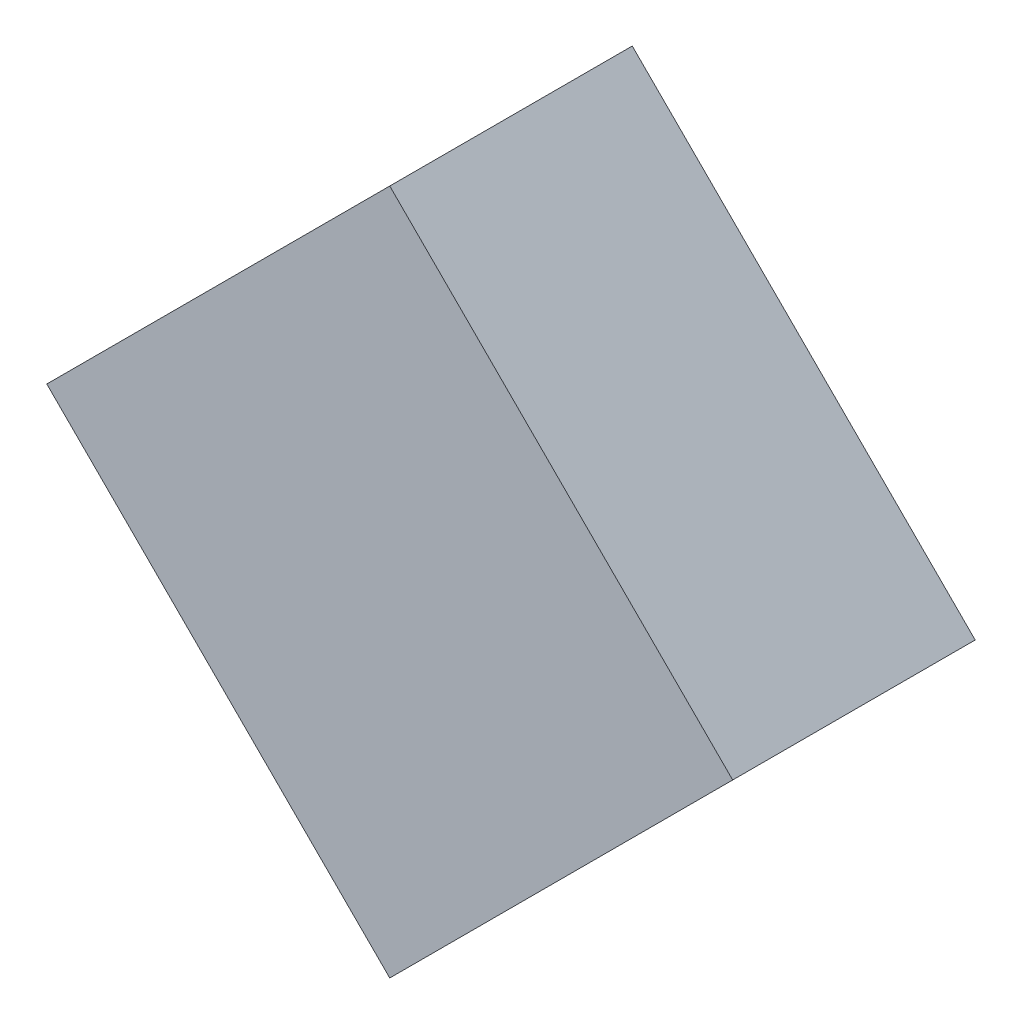
ISO-10303-21;
HEADER;
FILE_DESCRIPTION(('STEP AP214'),'2;1');
FILE_NAME('part.step','',(''),(''),'','','');
FILE_SCHEMA(('AUTOMOTIVE_DESIGN { 1 0 10303 214 1 1 1 1 }'));
ENDSEC;
DATA;
#1=APPLICATION_CONTEXT('core data for automotive mechanical design processes');
#2=APPLICATION_PROTOCOL_DEFINITION('international standard','automotive_design',2000,#1);
#3=PRODUCT_CONTEXT('',#1,'mechanical');
#4=PRODUCT('Part','Part','',(#3));
#5=PRODUCT_RELATED_PRODUCT_CATEGORY('part','',(#4));
#6=PRODUCT_DEFINITION_FORMATION('','',#4);
#7=PRODUCT_DEFINITION_CONTEXT('part definition',#1,'design');
#8=PRODUCT_DEFINITION('design','',#6,#7);
#9=PRODUCT_DEFINITION_SHAPE('','',#8);
#10=(LENGTH_UNIT() NAMED_UNIT(*) SI_UNIT(.MILLI.,.METRE.));
#11=(NAMED_UNIT(*) PLANE_ANGLE_UNIT() SI_UNIT($,.RADIAN.));
#12=(NAMED_UNIT(*) SI_UNIT($,.STERADIAN.) SOLID_ANGLE_UNIT());
#13=UNCERTAINTY_MEASURE_WITH_UNIT(LENGTH_MEASURE(1.E-05),#10,'distance_accuracy_value','');
#14=(GEOMETRIC_REPRESENTATION_CONTEXT(3) GLOBAL_UNCERTAINTY_ASSIGNED_CONTEXT((#13)) GLOBAL_UNIT_ASSIGNED_CONTEXT((#10,
#11,#12)) REPRESENTATION_CONTEXT('',''));
#15=CARTESIAN_POINT('',(0.,0.,0.));
#16=DIRECTION('',(0.,0.,1.));
#17=DIRECTION('',(1.,0.,0.));
#18=AXIS2_PLACEMENT_3D('',#15,#16,#17);
#19=CARTESIAN_POINT('',(88.557359312881,-22.95735931288,139.));
#20=DIRECTION('',(0.,0.,1.));
#21=DIRECTION('',(1.,0.,0.));
#22=AXIS2_PLACEMENT_3D('',#19,#20,#21);
#23=PLANE('',#22);
#24=DIRECTION('',(0.707106781186548,-0.707106781186548,0.));
#25=VECTOR('',#24,1.);
#26=CARTESIAN_POINT('',(88.557359312881,-22.95735931288,139.));
#27=LINE('',#26,#25);
#28=CARTESIAN_POINT('',(88.557359312881,-22.95735931288,139.));
#29=VERTEX_POINT('',#28);
#30=CARTESIAN_POINT('',(97.042640687119,-31.44264068711,139.));
#31=VERTEX_POINT('',#30);
#32=EDGE_CURVE('E69',#29,#31,#27,.T.);
#33=ORIENTED_EDGE('',*,*,#32,.F.);
#34=DIRECTION('',(-0.707106781186548,-0.707106781186548,0.));
#35=VECTOR('',#34,1.);
#36=CARTESIAN_POINT('',(88.557359312881,-22.95735931288,139.));
#37=LINE('',#36,#35);
#38=CARTESIAN_POINT('',(80.072077938642,-31.44264068711,139.));
#39=VERTEX_POINT('',#38);
#40=EDGE_CURVE('E17',#29,#39,#37,.T.);
#41=ORIENTED_EDGE('',*,*,#40,.T.);
#42=DIRECTION('',(0.707106781186548,-0.707106781186548,0.));
#43=VECTOR('',#42,1.);
#44=CARTESIAN_POINT('',(80.072077938642,-31.44264068711,139.));
#45=LINE('',#44,#43);
#46=CARTESIAN_POINT('',(88.557359312881,-39.92792206135,139.));
#47=VERTEX_POINT('',#46);
#48=EDGE_CURVE('E71',#39,#47,#45,.T.);
#49=ORIENTED_EDGE('',*,*,#48,.T.);
#50=DIRECTION('',(-0.707106781186548,-0.707106781186548,0.));
#51=VECTOR('',#50,1.);
#52=CARTESIAN_POINT('',(97.042640687119,-31.44264068711,139.));
#53=LINE('',#52,#51);
#54=EDGE_CURVE('E9',#31,#47,#53,.T.);
#55=ORIENTED_EDGE('',*,*,#54,.F.);
#56=EDGE_LOOP('',(#33,#41,#49,#55));
#57=FACE_BOUND('',#56,.T.);
#58=ADVANCED_FACE('F14',(#57),#23,.T.);
#59=CARTESIAN_POINT('',(88.557359312881,-22.95735931288,133.));
#60=DIRECTION('',(0.,0.,1.));
#61=DIRECTION('',(1.,0.,0.));
#62=AXIS2_PLACEMENT_3D('',#59,#60,#61);
#63=PLANE('',#62);
#64=DIRECTION('',(-0.707106781186548,-0.707106781186548,0.));
#65=VECTOR('',#64,1.);
#66=CARTESIAN_POINT('',(97.042640687119,-31.44264068711,133.));
#67=LINE('',#66,#65);
#68=CARTESIAN_POINT('',(97.042640687119,-31.44264068711,133.));
#69=VERTEX_POINT('',#68);
#70=CARTESIAN_POINT('',(88.557359312881,-39.92792206135,133.));
#71=VERTEX_POINT('',#70);
#72=EDGE_CURVE('E23',#69,#71,#67,.T.);
#73=ORIENTED_EDGE('',*,*,#72,.T.);
#74=DIRECTION('',(0.707106781186548,-0.707106781186548,0.));
#75=VECTOR('',#74,1.);
#76=CARTESIAN_POINT('',(80.072077938642,-31.44264068711,133.));
#77=LINE('',#76,#75);
#78=CARTESIAN_POINT('',(80.072077938642,-31.44264068711,133.));
#79=VERTEX_POINT('',#78);
#80=EDGE_CURVE('E111',#79,#71,#77,.T.);
#81=ORIENTED_EDGE('',*,*,#80,.F.);
#82=DIRECTION('',(-0.707106781186548,-0.707106781186548,0.));
#83=VECTOR('',#82,1.);
#84=CARTESIAN_POINT('',(88.557359312881,-22.95735931288,133.));
#85=LINE('',#84,#83);
#86=CARTESIAN_POINT('',(88.557359312881,-22.95735931288,133.));
#87=VERTEX_POINT('',#86);
#88=EDGE_CURVE('E96',#87,#79,#85,.T.);
#89=ORIENTED_EDGE('',*,*,#88,.F.);
#90=DIRECTION('',(0.707106781186548,-0.707106781186548,0.));
#91=VECTOR('',#90,1.);
#92=CARTESIAN_POINT('',(88.557359312881,-22.95735931288,133.));
#93=LINE('',#92,#91);
#94=EDGE_CURVE('E79',#87,#69,#93,.T.);
#95=ORIENTED_EDGE('',*,*,#94,.T.);
#96=EDGE_LOOP('',(#73,#81,#89,#95));
#97=FACE_BOUND('',#96,.T.);
#98=ADVANCED_FACE('F131',(#97),#63,.F.);
#99=CARTESIAN_POINT('',(97.042640687119,-31.44264068711,133.));
#100=DIRECTION('',(0.707106781186548,-0.707106781186548,0.));
#101=DIRECTION('',(0.,0.,-1.));
#102=AXIS2_PLACEMENT_3D('',#99,#100,#101);
#103=PLANE('',#102);
#104=ORIENTED_EDGE('',*,*,#72,.F.);
#105=DIRECTION('',(0.,0.,1.));
#106=VECTOR('',#105,1.);
#107=CARTESIAN_POINT('',(97.042640687119,-31.44264068711,133.));
#108=LINE('',#107,#106);
#109=EDGE_CURVE('E74',#69,#31,#108,.T.);
#110=ORIENTED_EDGE('',*,*,#109,.T.);
#111=ORIENTED_EDGE('',*,*,#54,.T.);
#112=DIRECTION('',(0.,0.,1.));
#113=VECTOR('',#112,1.);
#114=CARTESIAN_POINT('',(88.557359312881,-39.92792206135,133.));
#115=LINE('',#114,#113);
#116=EDGE_CURVE('E107',#71,#47,#115,.T.);
#117=ORIENTED_EDGE('',*,*,#116,.F.);
#118=EDGE_LOOP('',(#104,#110,#111,#117));
#119=FACE_BOUND('',#118,.T.);
#120=ADVANCED_FACE('F75',(#119),#103,.T.);
#121=CARTESIAN_POINT('',(88.557359312881,-22.95735931288,133.));
#122=DIRECTION('',(0.707106781186548,-0.707106781186548,0.));
#123=DIRECTION('',(0.,0.,-1.));
#124=AXIS2_PLACEMENT_3D('',#121,#122,#123);
#125=PLANE('',#124);
#126=DIRECTION('',(0.,0.,1.));
#127=VECTOR('',#126,1.);
#128=CARTESIAN_POINT('',(80.072077938642,-31.44264068711,133.));
#129=LINE('',#128,#127);
#130=EDGE_CURVE('E92',#79,#39,#129,.T.);
#131=ORIENTED_EDGE('',*,*,#130,.T.);
#132=ORIENTED_EDGE('',*,*,#40,.F.);
#133=DIRECTION('',(0.,0.,1.));
#134=VECTOR('',#133,1.);
#135=CARTESIAN_POINT('',(88.557359312881,-22.95735931288,133.));
#136=LINE('',#135,#134);
#137=EDGE_CURVE('E84',#87,#29,#136,.T.);
#138=ORIENTED_EDGE('',*,*,#137,.F.);
#139=ORIENTED_EDGE('',*,*,#88,.T.);
#140=EDGE_LOOP('',(#131,#132,#138,#139));
#141=FACE_BOUND('',#140,.T.);
#142=ADVANCED_FACE('F119',(#141),#125,.F.);
#143=CARTESIAN_POINT('',(80.072077938642,-31.44264068711,133.));
#144=DIRECTION('',(-0.707106781186548,-0.707106781186548,0.));
#145=DIRECTION('',(-0.707106781186548,0.707106781186548,0.));
#146=AXIS2_PLACEMENT_3D('',#143,#144,#145);
#147=PLANE('',#146);
#148=ORIENTED_EDGE('',*,*,#130,.F.);
#149=ORIENTED_EDGE('',*,*,#80,.T.);
#150=ORIENTED_EDGE('',*,*,#116,.T.);
#151=ORIENTED_EDGE('',*,*,#48,.F.);
#152=EDGE_LOOP('',(#148,#149,#150,#151));
#153=FACE_BOUND('',#152,.T.);
#154=ADVANCED_FACE('F120',(#153),#147,.T.);
#155=CARTESIAN_POINT('',(88.557359312881,-22.95735931288,133.));
#156=DIRECTION('',(-0.707106781186548,-0.707106781186548,0.));
#157=DIRECTION('',(-0.707106781186548,0.707106781186548,0.));
#158=AXIS2_PLACEMENT_3D('',#155,#156,#157);
#159=PLANE('',#158);
#160=ORIENTED_EDGE('',*,*,#32,.T.);
#161=ORIENTED_EDGE('',*,*,#109,.F.);
#162=ORIENTED_EDGE('',*,*,#94,.F.);
#163=ORIENTED_EDGE('',*,*,#137,.T.);
#164=EDGE_LOOP('',(#160,#161,#162,#163));
#165=FACE_BOUND('',#164,.T.);
#166=ADVANCED_FACE('F82',(#165),#159,.F.);
#167=CLOSED_SHELL('',(#58,#98,#120,#142,#154,#166));
#168=MANIFOLD_SOLID_BREP('B1',#167);
#169=ADVANCED_BREP_SHAPE_REPRESENTATION('',(#18,#168),#14);
#170=SHAPE_DEFINITION_REPRESENTATION(#9,#169);
ENDSEC;
END-ISO-10303-21;
